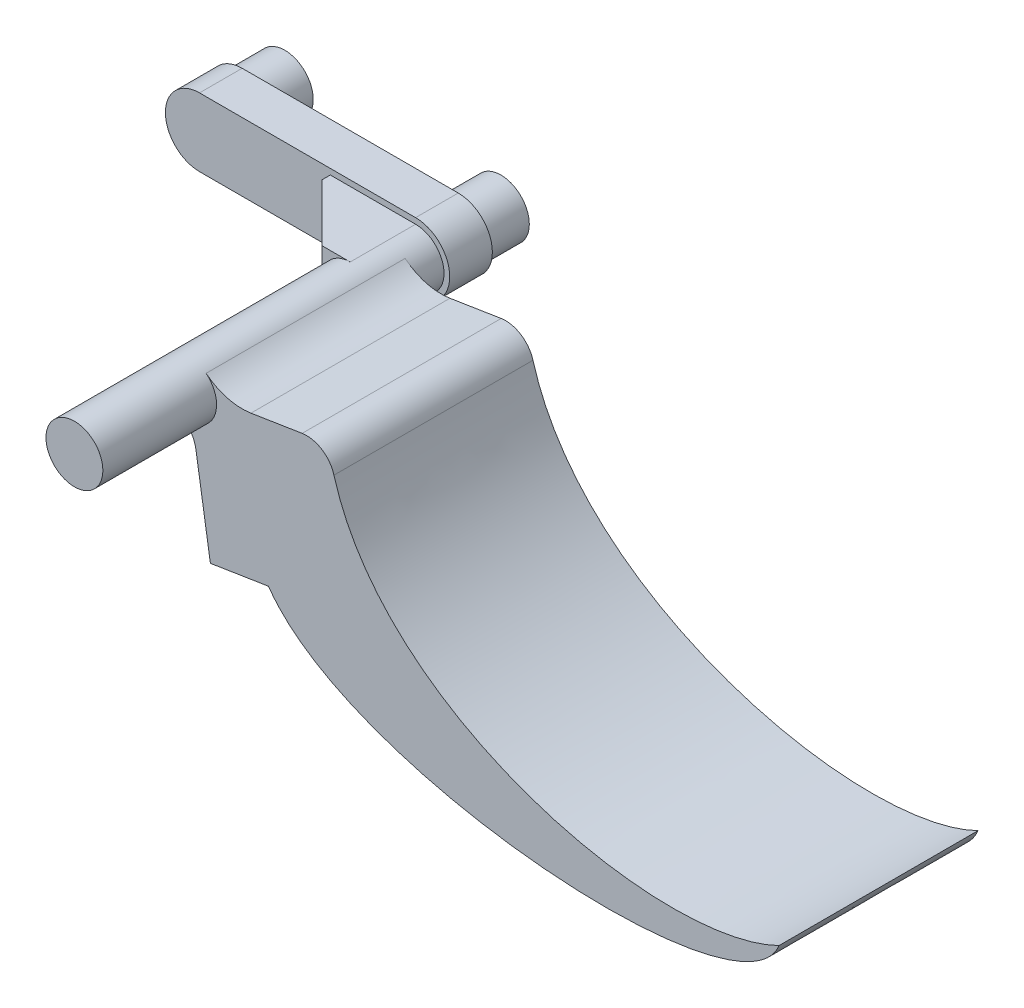
ISO-10303-21;
HEADER;
FILE_DESCRIPTION(('STEP AP214'),'2;1');
FILE_NAME('part.step','',(''),(''),'','','');
FILE_SCHEMA(('AUTOMOTIVE_DESIGN { 1 0 10303 214 1 1 1 1 }'));
ENDSEC;
DATA;
#1=APPLICATION_CONTEXT('core data for automotive mechanical design processes');
#2=APPLICATION_PROTOCOL_DEFINITION('international standard','automotive_design',2000,#1);
#3=PRODUCT_CONTEXT('',#1,'mechanical');
#4=PRODUCT('Part','Part','',(#3));
#5=PRODUCT_RELATED_PRODUCT_CATEGORY('part','',(#4));
#6=PRODUCT_DEFINITION_FORMATION('','',#4);
#7=PRODUCT_DEFINITION_CONTEXT('part definition',#1,'design');
#8=PRODUCT_DEFINITION('design','',#6,#7);
#9=PRODUCT_DEFINITION_SHAPE('','',#8);
#10=(LENGTH_UNIT() NAMED_UNIT(*) SI_UNIT(.MILLI.,.METRE.));
#11=(NAMED_UNIT(*) PLANE_ANGLE_UNIT() SI_UNIT($,.RADIAN.));
#12=(NAMED_UNIT(*) SI_UNIT($,.STERADIAN.) SOLID_ANGLE_UNIT());
#13=UNCERTAINTY_MEASURE_WITH_UNIT(LENGTH_MEASURE(1.E-05),#10,'distance_accuracy_value','');
#14=(GEOMETRIC_REPRESENTATION_CONTEXT(3) GLOBAL_UNCERTAINTY_ASSIGNED_CONTEXT((#13)) GLOBAL_UNIT_ASSIGNED_CONTEXT((#10,
#11,#12)) REPRESENTATION_CONTEXT('',''));
#15=CARTESIAN_POINT('',(0.,0.,0.));
#16=DIRECTION('',(0.,0.,1.));
#17=DIRECTION('',(1.,0.,0.));
#18=AXIS2_PLACEMENT_3D('',#15,#16,#17);
#19=CARTESIAN_POINT('',(0.,0.,5.3));
#20=DIRECTION('',(0.,0.,-1.));
#21=DIRECTION('',(-1.,0.,0.));
#22=AXIS2_PLACEMENT_3D('',#19,#20,#21);
#23=PLANE('',#22);
#24=DIRECTION('',(-1.,0.,0.));
#25=VECTOR('',#24,1.);
#26=CARTESIAN_POINT('',(0.,1.,5.3));
#27=LINE('',#26,#25);
#28=CARTESIAN_POINT('',(0.,1.,5.3));
#29=VERTEX_POINT('',#28);
#30=CARTESIAN_POINT('',(-1.00000000000001,1.,5.3));
#31=VERTEX_POINT('',#30);
#32=EDGE_CURVE('E315',#29,#31,#27,.T.);
#33=ORIENTED_EDGE('',*,*,#32,.T.);
#34=DIRECTION('',(0.,-1.,0.));
#35=VECTOR('',#34,1.);
#36=CARTESIAN_POINT('',(-1.00000000000001,0.,5.3));
#37=LINE('',#36,#35);
#38=CARTESIAN_POINT('',(-1.00000000000001,0.,5.3));
#39=VERTEX_POINT('',#38);
#40=EDGE_CURVE('E317',#31,#39,#37,.T.);
#41=ORIENTED_EDGE('',*,*,#40,.T.);
#42=CARTESIAN_POINT('',(0.,0.,5.3));
#43=DIRECTION('',(0.,0.,-1.));
#44=DIRECTION('',(-1.,0.,0.));
#45=AXIS2_PLACEMENT_3D('',#42,#43,#44);
#46=CIRCLE('',#45,1.);
#47=EDGE_CURVE('E319',#39,#29,#46,.T.);
#48=ORIENTED_EDGE('',*,*,#47,.T.);
#49=EDGE_LOOP('',(#33,#41,#48));
#50=FACE_BOUND('',#49,.T.);
#51=ADVANCED_FACE('F35',(#50),#23,.F.);
#52=CARTESIAN_POINT('',(0.,0.,15.));
#53=DIRECTION('',(0.,0.,-1.));
#54=DIRECTION('',(-1.,0.,0.));
#55=AXIS2_PLACEMENT_3D('',#52,#53,#54);
#56=CYLINDRICAL_SURFACE('',#55,1.);
#57=CARTESIAN_POINT('',(0.,0.,15.));
#58=DIRECTION('',(0.,0.,1.));
#59=DIRECTION('',(1.,0.,0.));
#60=AXIS2_PLACEMENT_3D('',#57,#58,#59);
#61=CIRCLE('',#60,1.);
#62=CARTESIAN_POINT('',(1.,0.,15.));
#63=VERTEX_POINT('',#62);
#64=EDGE_CURVE('E379',#63,#63,#61,.T.);
#65=ORIENTED_EDGE('',*,*,#64,.F.);
#66=EDGE_LOOP('',(#65));
#67=FACE_BOUND('',#66,.T.);
#68=DIRECTION('',(0.,0.,-1.));
#69=VECTOR('',#68,1.);
#70=CARTESIAN_POINT('',(0.631889780024741,0.775058259681351,15.));
#71=LINE('',#70,#69);
#72=CARTESIAN_POINT('',(0.631889780024741,0.775058259681351,11.));
#73=VERTEX_POINT('',#72);
#74=CARTESIAN_POINT('',(0.631889780024741,0.775058259681351,4.));
#75=VERTEX_POINT('',#74);
#76=EDGE_CURVE('E338',#73,#75,#71,.T.);
#77=ORIENTED_EDGE('',*,*,#76,.T.);
#78=CARTESIAN_POINT('',(0.,0.,4.));
#79=DIRECTION('',(0.,0.,-1.));
#80=DIRECTION('',(-1.,0.,0.));
#81=AXIS2_PLACEMENT_3D('',#78,#79,#80);
#82=CIRCLE('',#81,1.);
#83=CARTESIAN_POINT('',(0.,-1.,4.));
#84=VERTEX_POINT('',#83);
#85=EDGE_CURVE('E368',#75,#84,#82,.T.);
#86=ORIENTED_EDGE('',*,*,#85,.T.);
#87=DIRECTION('',(0.,0.,-1.));
#88=VECTOR('',#87,1.);
#89=CARTESIAN_POINT('',(0.,-1.,5.3));
#90=LINE('',#89,#88);
#91=CARTESIAN_POINT('',(0.,-1.,3.));
#92=VERTEX_POINT('',#91);
#93=EDGE_CURVE('E429',#84,#92,#90,.T.);
#94=ORIENTED_EDGE('',*,*,#93,.T.);
#95=CARTESIAN_POINT('',(0.,0.,3.));
#96=DIRECTION('',(0.,0.,-1.));
#97=DIRECTION('',(-1.,0.,0.));
#98=AXIS2_PLACEMENT_3D('',#95,#96,#97);
#99=CIRCLE('',#98,1.);
#100=CARTESIAN_POINT('',(0.,1.,3.));
#101=VERTEX_POINT('',#100);
#102=EDGE_CURVE('E376',#101,#92,#99,.T.);
#103=ORIENTED_EDGE('',*,*,#102,.F.);
#104=DIRECTION('',(0.,0.,-1.));
#105=VECTOR('',#104,1.);
#106=CARTESIAN_POINT('',(0.,1.,5.3));
#107=LINE('',#106,#105);
#108=EDGE_CURVE('E423',#29,#101,#107,.T.);
#109=ORIENTED_EDGE('',*,*,#108,.F.);
#110=ORIENTED_EDGE('',*,*,#47,.F.);
#111=CARTESIAN_POINT('',(-0.358367949545297,-0.933580426497203,5.3));
#112=VERTEX_POINT('',#111);
#113=EDGE_CURVE('E370',#112,#39,#46,.T.);
#114=ORIENTED_EDGE('',*,*,#113,.F.);
#115=DIRECTION('',(0.,0.,-1.));
#116=VECTOR('',#115,1.);
#117=CARTESIAN_POINT('',(-0.358367949545297,-0.933580426497203,15.));
#118=LINE('',#117,#116);
#119=CARTESIAN_POINT('',(-0.358367949545297,-0.933580426497203,11.));
#120=VERTEX_POINT('',#119);
#121=EDGE_CURVE('E347',#112,#120,#118,.F.);
#122=ORIENTED_EDGE('',*,*,#121,.T.);
#123=CARTESIAN_POINT('',(0.,0.,11.));
#124=DIRECTION('',(0.,0.,-1.));
#125=DIRECTION('',(-1.,0.,0.));
#126=AXIS2_PLACEMENT_3D('',#123,#124,#125);
#127=CIRCLE('',#126,1.);
#128=EDGE_CURVE('E366',#73,#120,#127,.T.);
#129=ORIENTED_EDGE('',*,*,#128,.F.);
#130=EDGE_LOOP('',(#77,#86,#94,#103,#109,#110,#114,#122,#129));
#131=FACE_BOUND('',#130,.T.);
#132=ADVANCED_FACE('F260',(#67,#131),#56,.T.);
#133=CARTESIAN_POINT('',(0.,0.00103630288871351,3.));
#134=DIRECTION('',(0.,0.,-1.));
#135=DIRECTION('',(-1.,0.,0.));
#136=AXIS2_PLACEMENT_3D('',#133,#134,#135);
#137=PLANE('',#136);
#138=CARTESIAN_POINT('',(0.,0.00103630288871351,3.));
#139=DIRECTION('',(0.,0.,-1.));
#140=DIRECTION('',(-1.,0.,0.));
#141=AXIS2_PLACEMENT_3D('',#138,#139,#140);
#142=CIRCLE('',#141,1.2);
#143=CARTESIAN_POINT('',(0.,1.20103630288871,3.));
#144=VERTEX_POINT('',#143);
#145=CARTESIAN_POINT('',(0.,-1.19896369711129,3.));
#146=VERTEX_POINT('',#145);
#147=EDGE_CURVE('E400',#144,#146,#142,.T.);
#148=ORIENTED_EDGE('',*,*,#147,.F.);
#149=DIRECTION('',(1.,0.,0.));
#150=VECTOR('',#149,1.);
#151=CARTESIAN_POINT('',(0.,1.20103630288871,3.));
#152=LINE('',#151,#150);
#153=CARTESIAN_POINT('',(-7.6,1.20103630288872,3.));
#154=VERTEX_POINT('',#153);
#155=EDGE_CURVE('E392',#154,#144,#152,.T.);
#156=ORIENTED_EDGE('',*,*,#155,.F.);
#157=CARTESIAN_POINT('',(-7.6,0.00103630288871459,3.));
#158=DIRECTION('',(0.,0.,-1.));
#159=DIRECTION('',(-1.,0.,0.));
#160=AXIS2_PLACEMENT_3D('',#157,#158,#159);
#161=CIRCLE('',#160,1.2);
#162=CARTESIAN_POINT('',(-7.6,-1.19896369711129,3.));
#163=VERTEX_POINT('',#162);
#164=EDGE_CURVE('E413',#163,#154,#161,.T.);
#165=ORIENTED_EDGE('',*,*,#164,.F.);
#166=DIRECTION('',(-1.,0.,0.));
#167=VECTOR('',#166,1.);
#168=CARTESIAN_POINT('',(0.,-1.19896369711129,3.));
#169=LINE('',#168,#167);
#170=EDGE_CURVE('E416',#146,#163,#169,.T.);
#171=ORIENTED_EDGE('',*,*,#170,.F.);
#172=EDGE_LOOP('',(#148,#156,#165,#171));
#173=FACE_BOUND('',#172,.T.);
#174=DIRECTION('',(-1.,0.,0.));
#175=VECTOR('',#174,1.);
#176=CARTESIAN_POINT('',(0.,1.,3.));
#177=LINE('',#176,#175);
#178=CARTESIAN_POINT('',(-3.,1.,3.));
#179=VERTEX_POINT('',#178);
#180=EDGE_CURVE('E436',#101,#179,#177,.T.);
#181=ORIENTED_EDGE('',*,*,#180,.F.);
#182=ORIENTED_EDGE('',*,*,#102,.T.);
#183=DIRECTION('',(1.,0.,0.));
#184=VECTOR('',#183,1.);
#185=CARTESIAN_POINT('',(0.,-1.,3.));
#186=LINE('',#185,#184);
#187=CARTESIAN_POINT('',(-3.,-1.,3.));
#188=VERTEX_POINT('',#187);
#189=EDGE_CURVE('E323',#188,#92,#186,.T.);
#190=ORIENTED_EDGE('',*,*,#189,.F.);
#191=DIRECTION('',(0.,-1.,0.));
#192=VECTOR('',#191,1.);
#193=CARTESIAN_POINT('',(-3.,1.,3.));
#194=LINE('',#193,#192);
#195=EDGE_CURVE('E433',#179,#188,#194,.T.);
#196=ORIENTED_EDGE('',*,*,#195,.F.);
#197=EDGE_LOOP('',(#181,#182,#190,#196));
#198=FACE_BOUND('',#197,.T.);
#199=ADVANCED_FACE('F256',(#173,#198),#137,.F.);
#200=CARTESIAN_POINT('',(0.,0.,15.));
#201=DIRECTION('',(0.,0.,1.));
#202=DIRECTION('',(1.,0.,0.));
#203=AXIS2_PLACEMENT_3D('',#200,#201,#202);
#204=PLANE('',#203);
#205=ORIENTED_EDGE('',*,*,#64,.T.);
#206=EDGE_LOOP('',(#205));
#207=FACE_BOUND('',#206,.T.);
#208=ADVANCED_FACE('F259',(#207),#204,.T.);
#209=CARTESIAN_POINT('',(0.,0.00103630288871351,3.));
#210=DIRECTION('',(0.,0.,-1.));
#211=DIRECTION('',(-1.,0.,0.));
#212=AXIS2_PLACEMENT_3D('',#209,#210,#211);
#213=CYLINDRICAL_SURFACE('',#212,1.2);
#214=CARTESIAN_POINT('',(0.,0.00103630288871351,1.5));
#215=DIRECTION('',(0.,0.,-1.));
#216=DIRECTION('',(-1.,0.,0.));
#217=AXIS2_PLACEMENT_3D('',#214,#215,#216);
#218=CIRCLE('',#217,1.2);
#219=CARTESIAN_POINT('',(0.,1.20103630288871,1.5));
#220=VERTEX_POINT('',#219);
#221=CARTESIAN_POINT('',(0.,-1.19896369711129,1.5));
#222=VERTEX_POINT('',#221);
#223=EDGE_CURVE('E407',#220,#222,#218,.T.);
#224=ORIENTED_EDGE('',*,*,#223,.F.);
#225=DIRECTION('',(0.,0.,-1.));
#226=VECTOR('',#225,1.);
#227=CARTESIAN_POINT('',(0.,1.20103630288871,3.));
#228=LINE('',#227,#226);
#229=EDGE_CURVE('E384',#144,#220,#228,.T.);
#230=ORIENTED_EDGE('',*,*,#229,.F.);
#231=ORIENTED_EDGE('',*,*,#147,.T.);
#232=DIRECTION('',(0.,0.,-1.));
#233=VECTOR('',#232,1.);
#234=CARTESIAN_POINT('',(0.,-1.19896369711129,3.));
#235=LINE('',#234,#233);
#236=EDGE_CURVE('E389',#146,#222,#235,.T.);
#237=ORIENTED_EDGE('',*,*,#236,.T.);
#238=EDGE_LOOP('',(#224,#230,#231,#237));
#239=FACE_BOUND('',#238,.T.);
#240=ADVANCED_FACE('F272',(#239),#213,.T.);
#241=CARTESIAN_POINT('',(0.,1.20103630288871,3.));
#242=DIRECTION('',(0.,1.,0.));
#243=DIRECTION('',(-1.,0.,0.));
#244=AXIS2_PLACEMENT_3D('',#241,#242,#243);
#245=PLANE('',#244);
#246=DIRECTION('',(1.,0.,0.));
#247=VECTOR('',#246,1.);
#248=CARTESIAN_POINT('',(0.,1.20103630288871,1.5));
#249=LINE('',#248,#247);
#250=CARTESIAN_POINT('',(-7.6,1.20103630288872,1.5));
#251=VERTEX_POINT('',#250);
#252=EDGE_CURVE('E397',#251,#220,#249,.T.);
#253=ORIENTED_EDGE('',*,*,#252,.F.);
#254=DIRECTION('',(0.,0.,-1.));
#255=VECTOR('',#254,1.);
#256=CARTESIAN_POINT('',(-7.6,1.20103630288872,3.));
#257=LINE('',#256,#255);
#258=EDGE_CURVE('E394',#154,#251,#257,.T.);
#259=ORIENTED_EDGE('',*,*,#258,.F.);
#260=ORIENTED_EDGE('',*,*,#155,.T.);
#261=ORIENTED_EDGE('',*,*,#229,.T.);
#262=EDGE_LOOP('',(#253,#259,#260,#261));
#263=FACE_BOUND('',#262,.T.);
#264=ADVANCED_FACE('F268',(#263),#245,.T.);
#265=CARTESIAN_POINT('',(-7.6,0.00103630288871459,3.));
#266=DIRECTION('',(0.,0.,-1.));
#267=DIRECTION('',(-1.,0.,0.));
#268=AXIS2_PLACEMENT_3D('',#265,#266,#267);
#269=CYLINDRICAL_SURFACE('',#268,1.2);
#270=CARTESIAN_POINT('',(-7.6,0.00103630288871459,1.5));
#271=DIRECTION('',(0.,0.,-1.));
#272=DIRECTION('',(-1.,0.,0.));
#273=AXIS2_PLACEMENT_3D('',#270,#271,#272);
#274=CIRCLE('',#273,1.2);
#275=CARTESIAN_POINT('',(-7.6,-1.19896369711129,1.5));
#276=VERTEX_POINT('',#275);
#277=EDGE_CURVE('E401',#276,#251,#274,.T.);
#278=ORIENTED_EDGE('',*,*,#277,.F.);
#279=DIRECTION('',(0.,0.,-1.));
#280=VECTOR('',#279,1.);
#281=CARTESIAN_POINT('',(-7.6,-1.19896369711129,3.));
#282=LINE('',#281,#280);
#283=EDGE_CURVE('E391',#163,#276,#282,.T.);
#284=ORIENTED_EDGE('',*,*,#283,.F.);
#285=ORIENTED_EDGE('',*,*,#164,.T.);
#286=ORIENTED_EDGE('',*,*,#258,.T.);
#287=EDGE_LOOP('',(#278,#284,#285,#286));
#288=FACE_BOUND('',#287,.T.);
#289=ADVANCED_FACE('F271',(#288),#269,.T.);
#290=CARTESIAN_POINT('',(0.,-1.19896369711129,3.));
#291=DIRECTION('',(0.,-1.,0.));
#292=DIRECTION('',(0.,0.,-1.));
#293=AXIS2_PLACEMENT_3D('',#290,#291,#292);
#294=PLANE('',#293);
#295=DIRECTION('',(-1.,0.,0.));
#296=VECTOR('',#295,1.);
#297=CARTESIAN_POINT('',(0.,-1.19896369711129,1.5));
#298=LINE('',#297,#296);
#299=EDGE_CURVE('E404',#222,#276,#298,.T.);
#300=ORIENTED_EDGE('',*,*,#299,.F.);
#301=ORIENTED_EDGE('',*,*,#236,.F.);
#302=ORIENTED_EDGE('',*,*,#170,.T.);
#303=ORIENTED_EDGE('',*,*,#283,.T.);
#304=EDGE_LOOP('',(#300,#301,#302,#303));
#305=FACE_BOUND('',#304,.T.);
#306=ADVANCED_FACE('F266',(#305),#294,.T.);
#307=CARTESIAN_POINT('',(0.,0.00103630288871351,1.5));
#308=DIRECTION('',(0.,0.,-1.));
#309=DIRECTION('',(-1.,0.,0.));
#310=AXIS2_PLACEMENT_3D('',#307,#308,#309);
#311=PLANE('',#310);
#312=CARTESIAN_POINT('',(-7.6,0.00103630288871459,1.5));
#313=DIRECTION('',(0.,0.,-1.));
#314=DIRECTION('',(-1.,0.,0.));
#315=AXIS2_PLACEMENT_3D('',#312,#313,#314);
#316=CIRCLE('',#315,0.999999999999999);
#317=CARTESIAN_POINT('',(-8.6,0.00103630288871459,1.5));
#318=VERTEX_POINT('',#317);
#319=EDGE_CURVE('E373',#318,#318,#316,.T.);
#320=ORIENTED_EDGE('',*,*,#319,.F.);
#321=EDGE_LOOP('',(#320));
#322=FACE_BOUND('',#321,.T.);
#323=CARTESIAN_POINT('',(0.,0.,1.5));
#324=DIRECTION('',(0.,0.,-1.));
#325=DIRECTION('',(-1.,0.,0.));
#326=AXIS2_PLACEMENT_3D('',#323,#324,#325);
#327=CIRCLE('',#326,1.);
#328=CARTESIAN_POINT('',(-1.,0.,1.5));
#329=VERTEX_POINT('',#328);
#330=EDGE_CURVE('E380',#329,#329,#327,.T.);
#331=ORIENTED_EDGE('',*,*,#330,.F.);
#332=EDGE_LOOP('',(#331));
#333=FACE_BOUND('',#332,.T.);
#334=ORIENTED_EDGE('',*,*,#223,.T.);
#335=ORIENTED_EDGE('',*,*,#299,.T.);
#336=ORIENTED_EDGE('',*,*,#277,.T.);
#337=ORIENTED_EDGE('',*,*,#252,.T.);
#338=EDGE_LOOP('',(#334,#335,#336,#337));
#339=FACE_BOUND('',#338,.T.);
#340=ADVANCED_FACE('F262',(#322,#333,#339),#311,.T.);
#341=CARTESIAN_POINT('',(0.,0.,0.));
#342=DIRECTION('',(0.,0.,1.));
#343=DIRECTION('',(1.,0.,0.));
#344=AXIS2_PLACEMENT_3D('',#341,#342,#343);
#345=PLANE('',#344);
#346=CARTESIAN_POINT('',(0.,0.,0.));
#347=DIRECTION('',(0.,0.,1.));
#348=DIRECTION('',(1.,0.,0.));
#349=AXIS2_PLACEMENT_3D('',#346,#347,#348);
#350=CIRCLE('',#349,1.);
#351=CARTESIAN_POINT('',(1.,0.,0.));
#352=VERTEX_POINT('',#351);
#353=EDGE_CURVE('E383',#352,#352,#350,.T.);
#354=ORIENTED_EDGE('',*,*,#353,.F.);
#355=EDGE_LOOP('',(#354));
#356=FACE_BOUND('',#355,.T.);
#357=ADVANCED_FACE('F265',(#356),#345,.F.);
#358=ORIENTED_EDGE('',*,*,#330,.T.);
#359=EDGE_LOOP('',(#358));
#360=FACE_BOUND('',#359,.T.);
#361=ORIENTED_EDGE('',*,*,#353,.T.);
#362=EDGE_LOOP('',(#361));
#363=FACE_BOUND('',#362,.T.);
#364=ADVANCED_FACE('F254',(#360,#363),#56,.T.);
#365=CARTESIAN_POINT('',(-7.6,0.00103630288871459,0.));
#366=DIRECTION('',(0.,0.,1.));
#367=DIRECTION('',(1.,0.,0.));
#368=AXIS2_PLACEMENT_3D('',#365,#366,#367);
#369=CYLINDRICAL_SURFACE('',#368,0.999999999999999);
#370=ORIENTED_EDGE('',*,*,#319,.T.);
#371=EDGE_LOOP('',(#370));
#372=FACE_BOUND('',#371,.T.);
#373=CARTESIAN_POINT('',(-7.6,0.00103630288871459,0.));
#374=DIRECTION('',(0.,0.,1.));
#375=DIRECTION('',(1.,0.,0.));
#376=AXIS2_PLACEMENT_3D('',#373,#374,#375);
#377=CIRCLE('',#376,0.999999999999999);
#378=CARTESIAN_POINT('',(-6.6,0.00103630288871459,0.));
#379=VERTEX_POINT('',#378);
#380=EDGE_CURVE('E410',#379,#379,#377,.T.);
#381=ORIENTED_EDGE('',*,*,#380,.T.);
#382=EDGE_LOOP('',(#381));
#383=FACE_BOUND('',#382,.T.);
#384=ADVANCED_FACE('F250',(#372,#383),#369,.T.);
#385=CARTESIAN_POINT('',(-7.6,0.00103630288871459,0.));
#386=DIRECTION('',(0.,0.,1.));
#387=DIRECTION('',(1.,0.,0.));
#388=AXIS2_PLACEMENT_3D('',#385,#386,#387);
#389=PLANE('',#388);
#390=ORIENTED_EDGE('',*,*,#380,.F.);
#391=EDGE_LOOP('',(#390));
#392=FACE_BOUND('',#391,.T.);
#393=ADVANCED_FACE('F246',(#392),#389,.F.);
#394=CARTESIAN_POINT('',(0.,1.,5.3));
#395=DIRECTION('',(0.,-1.,0.));
#396=DIRECTION('',(1.,0.,0.));
#397=AXIS2_PLACEMENT_3D('',#394,#395,#396);
#398=PLANE('',#397);
#399=DIRECTION('',(0.,0.,-1.));
#400=VECTOR('',#399,1.);
#401=CARTESIAN_POINT('',(-3.,1.,5.3));
#402=LINE('',#401,#400);
#403=CARTESIAN_POINT('',(-3.,1.,3.3));
#404=VERTEX_POINT('',#403);
#405=EDGE_CURVE('E425',#404,#179,#402,.T.);
#406=ORIENTED_EDGE('',*,*,#405,.F.);
#407=DIRECTION('',(-0.707106781186546,0.,-0.707106781186549));
#408=VECTOR('',#407,1.);
#409=CARTESIAN_POINT('',(-1.00000000000001,1.,5.3));
#410=LINE('',#409,#408);
#411=EDGE_CURVE('E11',#404,#31,#410,.F.);
#412=ORIENTED_EDGE('',*,*,#411,.T.);
#413=ORIENTED_EDGE('',*,*,#32,.F.);
#414=ORIENTED_EDGE('',*,*,#108,.T.);
#415=ORIENTED_EDGE('',*,*,#180,.T.);
#416=EDGE_LOOP('',(#406,#412,#413,#414,#415));
#417=FACE_BOUND('',#416,.T.);
#418=ADVANCED_FACE('F243',(#417),#398,.F.);
#419=CARTESIAN_POINT('',(-3.,1.,5.3));
#420=DIRECTION('',(1.,0.,0.));
#421=DIRECTION('',(0.,0.,-1.));
#422=AXIS2_PLACEMENT_3D('',#419,#420,#421);
#423=PLANE('',#422);
#424=DIRECTION('',(0.,0.,-1.));
#425=VECTOR('',#424,1.);
#426=CARTESIAN_POINT('',(-3.,-1.,5.3));
#427=LINE('',#426,#425);
#428=CARTESIAN_POINT('',(-3.,-1.,3.3));
#429=VERTEX_POINT('',#428);
#430=EDGE_CURVE('E427',#429,#188,#427,.T.);
#431=ORIENTED_EDGE('',*,*,#430,.F.);
#432=DIRECTION('',(0.,1.,0.));
#433=VECTOR('',#432,1.);
#434=CARTESIAN_POINT('',(-3.,1.,3.3));
#435=LINE('',#434,#433);
#436=EDGE_CURVE('E44',#429,#404,#435,.T.);
#437=ORIENTED_EDGE('',*,*,#436,.T.);
#438=ORIENTED_EDGE('',*,*,#405,.T.);
#439=ORIENTED_EDGE('',*,*,#195,.T.);
#440=EDGE_LOOP('',(#431,#437,#438,#439));
#441=FACE_BOUND('',#440,.T.);
#442=ADVANCED_FACE('F240',(#441),#423,.F.);
#443=CARTESIAN_POINT('',(0.,-1.,5.3));
#444=DIRECTION('',(0.,1.,0.));
#445=DIRECTION('',(0.,0.,1.));
#446=AXIS2_PLACEMENT_3D('',#443,#444,#445);
#447=PLANE('',#446);
#448=DIRECTION('',(1.,0.,0.));
#449=VECTOR('',#448,1.);
#450=CARTESIAN_POINT('',(0.,-1.,5.3));
#451=LINE('',#450,#449);
#452=CARTESIAN_POINT('',(-1.00000000000001,-1.,5.3));
#453=VERTEX_POINT('',#452);
#454=CARTESIAN_POINT('',(-0.218707732182321,-1.,5.3));
#455=VERTEX_POINT('',#454);
#456=EDGE_CURVE('E322',#453,#455,#451,.T.);
#457=ORIENTED_EDGE('',*,*,#456,.F.);
#458=DIRECTION('',(0.707106781186546,0.,0.707106781186549));
#459=VECTOR('',#458,1.);
#460=CARTESIAN_POINT('',(-1.00000000000001,-1.,5.3));
#461=LINE('',#460,#459);
#462=EDGE_CURVE('E58',#453,#429,#461,.F.);
#463=ORIENTED_EDGE('',*,*,#462,.T.);
#464=ORIENTED_EDGE('',*,*,#430,.T.);
#465=ORIENTED_EDGE('',*,*,#189,.T.);
#466=ORIENTED_EDGE('',*,*,#93,.F.);
#467=DIRECTION('',(-1.,0.,0.));
#468=VECTOR('',#467,1.);
#469=CARTESIAN_POINT('',(0.,-1.,4.));
#470=LINE('',#469,#468);
#471=CARTESIAN_POINT('',(-0.218707732182321,-1.,4.));
#472=VERTEX_POINT('',#471);
#473=EDGE_CURVE('E355',#84,#472,#470,.T.);
#474=ORIENTED_EDGE('',*,*,#473,.T.);
#475=DIRECTION('',(0.,0.,-1.));
#476=VECTOR('',#475,1.);
#477=CARTESIAN_POINT('',(-0.218707732182321,-1.,15.));
#478=LINE('',#477,#476);
#479=EDGE_CURVE('E352',#472,#455,#478,.F.);
#480=ORIENTED_EDGE('',*,*,#479,.T.);
#481=EDGE_LOOP('',(#457,#463,#464,#465,#466,#474,#480));
#482=FACE_BOUND('',#481,.T.);
#483=ADVANCED_FACE('F236',(#482),#447,.F.);
#484=ORIENTED_EDGE('',*,*,#113,.T.);
#485=DIRECTION('',(0.,-1.,0.));
#486=VECTOR('',#485,1.);
#487=CARTESIAN_POINT('',(-1.00000000000001,0.,5.3));
#488=LINE('',#487,#486);
#489=EDGE_CURVE('E326',#39,#453,#488,.T.);
#490=ORIENTED_EDGE('',*,*,#489,.T.);
#491=ORIENTED_EDGE('',*,*,#456,.T.);
#492=CARTESIAN_POINT('',(-0.716735899090594,-1.86716085299441,5.3));
#493=DIRECTION('',(0.,0.,-1.));
#494=DIRECTION('',(-1.,0.,0.));
#495=AXIS2_PLACEMENT_3D('',#492,#493,#494);
#496=CIRCLE('',#495,1.);
#497=EDGE_CURVE('E350',#455,#112,#496,.F.);
#498=ORIENTED_EDGE('',*,*,#497,.T.);
#499=EDGE_LOOP('',(#484,#490,#491,#498));
#500=FACE_BOUND('',#499,.T.);
#501=ADVANCED_FACE('F232',(#500),#23,.F.);
#502=CARTESIAN_POINT('',(0.,0.,11.));
#503=DIRECTION('',(-0.156434465040235,0.987688340595137,0.));
#504=DIRECTION('',(-0.987688340595137,-0.156434465040235,0.));
#505=AXIS2_PLACEMENT_3D('',#502,#503,#504);
#506=PLANE('',#505);
#507=DIRECTION('',(0.987688340595137,0.156434465040234,0.));
#508=VECTOR('',#507,1.);
#509=CARTESIAN_POINT('',(0.,0.,4.));
#510=LINE('',#509,#508);
#511=CARTESIAN_POINT('',(2.20853827015469,0.349798097853779,4.));
#512=VERTEX_POINT('',#511);
#513=CARTESIAN_POINT('',(4.00977644076124,0.635086197396496,4.));
#514=VERTEX_POINT('',#513);
#515=EDGE_CURVE('E450',#512,#514,#510,.T.);
#516=ORIENTED_EDGE('',*,*,#515,.F.);
#517=DIRECTION('',(0.,0.,-1.));
#518=VECTOR('',#517,1.);
#519=CARTESIAN_POINT('',(2.20853827015469,0.349798097853779,11.));
#520=LINE('',#519,#518);
#521=CARTESIAN_POINT('',(2.20853827015469,0.349798097853779,11.));
#522=VERTEX_POINT('',#521);
#523=EDGE_CURVE('E336',#512,#522,#520,.F.);
#524=ORIENTED_EDGE('',*,*,#523,.T.);
#525=DIRECTION('',(0.987688340595137,0.156434465040234,0.));
#526=VECTOR('',#525,1.);
#527=CARTESIAN_POINT('',(0.,0.,11.));
#528=LINE('',#527,#526);
#529=CARTESIAN_POINT('',(4.00977644076124,0.635086197396496,11.));
#530=VERTEX_POINT('',#529);
#531=EDGE_CURVE('E447',#522,#530,#528,.T.);
#532=ORIENTED_EDGE('',*,*,#531,.T.);
#533=DIRECTION('',(0.,0.,-1.));
#534=VECTOR('',#533,1.);
#535=CARTESIAN_POINT('',(4.00977644076124,0.635086197396496,11.));
#536=LINE('',#535,#534);
#537=EDGE_CURVE('E363',#530,#514,#536,.T.);
#538=ORIENTED_EDGE('',*,*,#537,.T.);
#539=EDGE_LOOP('',(#516,#524,#532,#538));
#540=FACE_BOUND('',#539,.T.);
#541=ADVANCED_FACE('F225',(#540),#506,.T.);
#542=CARTESIAN_POINT('',(0.,0.,11.));
#543=DIRECTION('',(-0.987688340595137,-0.156434465040235,0.));
#544=DIRECTION('',(0.156434465040235,-0.987688340595137,0.));
#545=AXIS2_PLACEMENT_3D('',#542,#543,#544);
#546=PLANE('',#545);
#547=DIRECTION('',(-0.156434465040234,0.987688340595137,0.));
#548=VECTOR('',#547,1.);
#549=CARTESIAN_POINT('',(0.,0.,11.));
#550=LINE('',#549,#548);
#551=CARTESIAN_POINT('',(0.782172325201172,-4.93844170297569,11.));
#552=VERTEX_POINT('',#551);
#553=CARTESIAN_POINT('',(0.270952441504543,-1.71072638795417,11.));
#554=VERTEX_POINT('',#553);
#555=EDGE_CURVE('E443',#552,#554,#550,.T.);
#556=ORIENTED_EDGE('',*,*,#555,.T.);
#557=DIRECTION('',(0.,0.,-1.));
#558=VECTOR('',#557,1.);
#559=CARTESIAN_POINT('',(0.270952441504543,-1.71072638795417,11.));
#560=LINE('',#559,#558);
#561=CARTESIAN_POINT('',(0.270952441504543,-1.71072638795417,4.));
#562=VERTEX_POINT('',#561);
#563=EDGE_CURVE('E345',#554,#562,#560,.T.);
#564=ORIENTED_EDGE('',*,*,#563,.T.);
#565=DIRECTION('',(-0.156434465040234,0.987688340595137,0.));
#566=VECTOR('',#565,1.);
#567=CARTESIAN_POINT('',(0.,0.,4.));
#568=LINE('',#567,#566);
#569=CARTESIAN_POINT('',(0.782172325201172,-4.93844170297569,4.));
#570=VERTEX_POINT('',#569);
#571=EDGE_CURVE('E444',#570,#562,#568,.T.);
#572=ORIENTED_EDGE('',*,*,#571,.F.);
#573=DIRECTION('',(0.,0.,-1.));
#574=VECTOR('',#573,1.);
#575=CARTESIAN_POINT('',(0.782172325201172,-4.93844170297569,11.));
#576=LINE('',#575,#574);
#577=EDGE_CURVE('E439',#552,#570,#576,.T.);
#578=ORIENTED_EDGE('',*,*,#577,.F.);
#579=EDGE_LOOP('',(#556,#564,#572,#578));
#580=FACE_BOUND('',#579,.T.);
#581=ADVANCED_FACE('F222',(#580),#546,.T.);
#582=CARTESIAN_POINT('',(0.782172325201172,-4.93844170297569,11.));
#583=DIRECTION('',(0.156434465040234,-0.987688340595137,0.));
#584=DIRECTION('',(0.987688340595137,0.156434465040234,0.));
#585=AXIS2_PLACEMENT_3D('',#582,#583,#584);
#586=PLANE('',#585);
#587=DIRECTION('',(0.,0.,-1.));
#588=VECTOR('',#587,1.);
#589=CARTESIAN_POINT('',(2.82663059289347,-4.61463132448036,11.));
#590=LINE('',#589,#588);
#591=CARTESIAN_POINT('',(2.82663059289347,-4.61463132448036,11.));
#592=VERTEX_POINT('',#591);
#593=CARTESIAN_POINT('',(2.82663059289347,-4.61463132448036,4.));
#594=VERTEX_POINT('',#593);
#595=EDGE_CURVE('E188',#592,#594,#590,.T.);
#596=ORIENTED_EDGE('',*,*,#595,.F.);
#597=DIRECTION('',(-0.987688340595137,-0.156434465040234,0.));
#598=VECTOR('',#597,1.);
#599=CARTESIAN_POINT('',(0.782172325201172,-4.93844170297569,11.));
#600=LINE('',#599,#598);
#601=EDGE_CURVE('E193',#592,#552,#600,.T.);
#602=ORIENTED_EDGE('',*,*,#601,.T.);
#603=ORIENTED_EDGE('',*,*,#577,.T.);
#604=DIRECTION('',(-0.987688340595137,-0.156434465040234,0.));
#605=VECTOR('',#604,1.);
#606=CARTESIAN_POINT('',(0.782172325201172,-4.93844170297569,4.));
#607=LINE('',#606,#605);
#608=EDGE_CURVE('E448',#594,#570,#607,.T.);
#609=ORIENTED_EDGE('',*,*,#608,.F.);
#610=EDGE_LOOP('',(#596,#602,#603,#609));
#611=FACE_BOUND('',#610,.T.);
#612=ADVANCED_FACE('F218',(#611),#586,.T.);
#613=CARTESIAN_POINT('',(0.,0.,11.));
#614=DIRECTION('',(0.,0.,-1.));
#615=DIRECTION('',(-1.,0.,0.));
#616=AXIS2_PLACEMENT_3D('',#613,#614,#615);
#617=PLANE('',#616);
#618=CARTESIAN_POINT('',(4.93844170297569,0.782172325201172,11.));
#619=CARTESIAN_POINT('',(6.03592471295213,-6.14706269136757,11.));
#620=CARTESIAN_POINT('',(16.4473078553857,-8.70788039402081,11.));
#621=CARTESIAN_POINT('',(20.7821723252012,-6.58248103840503,11.));
#622=B_SPLINE_CURVE_WITH_KNOTS('',3,(#618,#619,#620,#621),.UNSPECIFIED.,.F.,.F.,(4,4),(0.,1.),.UNSPECIFIED.);
#623=CARTESIAN_POINT('',(5.12813910541519,-0.0792998585614298,11.));
#624=VERTEX_POINT('',#623);
#625=CARTESIAN_POINT('',(20.7821723252012,-6.58248103840503,11.));
#626=VERTEX_POINT('',#625);
#627=EDGE_CURVE('E169',#624,#626,#622,.T.);
#628=ORIENTED_EDGE('',*,*,#627,.F.);
#629=CARTESIAN_POINT('',(4.16621090580148,-0.352602143198641,11.));
#630=DIRECTION('',(0.,0.,-1.));
#631=DIRECTION('',(-1.,0.,0.));
#632=AXIS2_PLACEMENT_3D('',#629,#630,#631);
#633=CIRCLE('',#632,1.);
#634=EDGE_CURVE('E358',#624,#530,#633,.F.);
#635=ORIENTED_EDGE('',*,*,#634,.T.);
#636=ORIENTED_EDGE('',*,*,#531,.F.);
#637=CARTESIAN_POINT('',(1.89566934007422,2.32517477904405,11.));
#638=DIRECTION('',(0.,0.,-1.));
#639=DIRECTION('',(-1.,0.,0.));
#640=AXIS2_PLACEMENT_3D('',#637,#638,#639);
#641=CIRCLE('',#640,2.);
#642=EDGE_CURVE('E329',#522,#73,#641,.T.);
#643=ORIENTED_EDGE('',*,*,#642,.T.);
#644=ORIENTED_EDGE('',*,*,#128,.T.);
#645=CARTESIAN_POINT('',(-0.716735899090594,-1.86716085299441,11.));
#646=DIRECTION('',(0.,0.,-1.));
#647=DIRECTION('',(-1.,0.,0.));
#648=AXIS2_PLACEMENT_3D('',#645,#646,#647);
#649=CIRCLE('',#648,1.);
#650=EDGE_CURVE('E343',#120,#554,#649,.T.);
#651=ORIENTED_EDGE('',*,*,#650,.T.);
#652=ORIENTED_EDGE('',*,*,#555,.F.);
#653=ORIENTED_EDGE('',*,*,#601,.F.);
#654=CARTESIAN_POINT('',(20.7821723252012,-6.58248103840503,11.));
#655=CARTESIAN_POINT('',(19.5025859515414,-9.76132866167443,11.));
#656=CARTESIAN_POINT('',(5.67735167401639,-8.78742509281271,11.));
#657=CARTESIAN_POINT('',(2.82663059289346,-4.61463132448035,11.));
#658=B_SPLINE_CURVE_WITH_KNOTS('',3,(#654,#655,#656,#657),.UNSPECIFIED.,.F.,.F.,(4,4),(0.,1.),.UNSPECIFIED.);
#659=EDGE_CURVE('E181',#626,#592,#658,.T.);
#660=ORIENTED_EDGE('',*,*,#659,.F.);
#661=EDGE_LOOP('',(#628,#635,#636,#643,#644,#651,#652,#653,#660));
#662=FACE_BOUND('',#661,.T.);
#663=ADVANCED_FACE('F191',(#662),#617,.F.);
#664=CARTESIAN_POINT('',(0.,0.,4.));
#665=DIRECTION('',(0.,0.,-1.));
#666=DIRECTION('',(-1.,0.,0.));
#667=AXIS2_PLACEMENT_3D('',#664,#665,#666);
#668=PLANE('',#667);
#669=ORIENTED_EDGE('',*,*,#85,.F.);
#670=CARTESIAN_POINT('',(1.89566934007422,2.32517477904405,4.));
#671=DIRECTION('',(0.,0.,-1.));
#672=DIRECTION('',(-1.,0.,0.));
#673=AXIS2_PLACEMENT_3D('',#670,#671,#672);
#674=CIRCLE('',#673,2.);
#675=EDGE_CURVE('E334',#75,#512,#674,.F.);
#676=ORIENTED_EDGE('',*,*,#675,.T.);
#677=ORIENTED_EDGE('',*,*,#515,.T.);
#678=CARTESIAN_POINT('',(4.16621090580148,-0.352602143198641,4.));
#679=DIRECTION('',(0.,0.,-1.));
#680=DIRECTION('',(-1.,0.,0.));
#681=AXIS2_PLACEMENT_3D('',#678,#679,#680);
#682=CIRCLE('',#681,1.);
#683=CARTESIAN_POINT('',(5.12813910541519,-0.0792998585614298,4.));
#684=VERTEX_POINT('',#683);
#685=EDGE_CURVE('E361',#514,#684,#682,.T.);
#686=ORIENTED_EDGE('',*,*,#685,.T.);
#687=CARTESIAN_POINT('',(4.93844170297569,0.782172325201172,4.));
#688=CARTESIAN_POINT('',(6.03592471295213,-6.14706269136757,4.));
#689=CARTESIAN_POINT('',(16.4473078553857,-8.70788039402081,4.));
#690=CARTESIAN_POINT('',(20.7821723252012,-6.58248103840503,4.));
#691=B_SPLINE_CURVE_WITH_KNOTS('',3,(#687,#688,#689,#690),.UNSPECIFIED.,.F.,.F.,(4,4),(0.,1.),.UNSPECIFIED.);
#692=CARTESIAN_POINT('',(20.7821723252012,-6.58248103840503,4.));
#693=VERTEX_POINT('',#692);
#694=EDGE_CURVE('E202',#684,#693,#691,.T.);
#695=ORIENTED_EDGE('',*,*,#694,.T.);
#696=CARTESIAN_POINT('',(20.7821723252012,-6.58248103840503,4.));
#697=CARTESIAN_POINT('',(19.5025859515414,-9.76132866167443,4.));
#698=CARTESIAN_POINT('',(5.67735167401639,-8.78742509281271,4.));
#699=CARTESIAN_POINT('',(2.82663059289346,-4.61463132448035,4.));
#700=B_SPLINE_CURVE_WITH_KNOTS('',3,(#696,#697,#698,#699),.UNSPECIFIED.,.F.,.F.,(4,4),(0.,1.),.UNSPECIFIED.);
#701=EDGE_CURVE('E182',#693,#594,#700,.T.);
#702=ORIENTED_EDGE('',*,*,#701,.T.);
#703=ORIENTED_EDGE('',*,*,#608,.T.);
#704=ORIENTED_EDGE('',*,*,#571,.T.);
#705=CARTESIAN_POINT('',(-0.716735899090594,-1.86716085299441,4.));
#706=DIRECTION('',(0.,0.,-1.));
#707=DIRECTION('',(-1.,0.,0.));
#708=AXIS2_PLACEMENT_3D('',#705,#706,#707);
#709=CIRCLE('',#708,1.);
#710=EDGE_CURVE('E341',#562,#472,#709,.F.);
#711=ORIENTED_EDGE('',*,*,#710,.T.);
#712=ORIENTED_EDGE('',*,*,#473,.F.);
#713=EDGE_LOOP('',(#669,#676,#677,#686,#695,#702,#703,#704,#711,#712));
#714=FACE_BOUND('',#713,.T.);
#715=ADVANCED_FACE('F215',(#714),#668,.T.);
#716=DIRECTION('',(0.,0.,-1.));
#717=VECTOR('',#716,1.);
#718=SURFACE_OF_LINEAR_EXTRUSION('',#622,#717);
#719=ORIENTED_EDGE('',*,*,#694,.F.);
#720=DIRECTION('',(0.,0.,-1.));
#721=VECTOR('',#720,1.);
#722=CARTESIAN_POINT('',(5.12813910541519,-0.0792998585614301,4.));
#723=LINE('',#722,#721);
#724=EDGE_CURVE('E176',#684,#624,#723,.F.);
#725=ORIENTED_EDGE('',*,*,#724,.T.);
#726=ORIENTED_EDGE('',*,*,#627,.T.);
#727=DIRECTION('',(0.,0.,-1.));
#728=VECTOR('',#727,1.);
#729=CARTESIAN_POINT('',(20.7821723252012,-6.58248103840503,11.));
#730=LINE('',#729,#728);
#731=EDGE_CURVE('E173',#626,#693,#730,.T.);
#732=ORIENTED_EDGE('',*,*,#731,.T.);
#733=EDGE_LOOP('',(#719,#725,#726,#732));
#734=FACE_BOUND('',#733,.T.);
#735=ADVANCED_FACE('F172',(#734),#718,.T.);
#736=DIRECTION('',(0.,0.,-1.));
#737=VECTOR('',#736,1.);
#738=SURFACE_OF_LINEAR_EXTRUSION('',#658,#737);
#739=ORIENTED_EDGE('',*,*,#701,.F.);
#740=ORIENTED_EDGE('',*,*,#731,.F.);
#741=ORIENTED_EDGE('',*,*,#659,.T.);
#742=ORIENTED_EDGE('',*,*,#595,.T.);
#743=EDGE_LOOP('',(#739,#740,#741,#742));
#744=FACE_BOUND('',#743,.T.);
#745=ADVANCED_FACE('F185',(#744),#738,.T.);
#746=CARTESIAN_POINT('',(4.16621090580148,-0.352602143198641,7.5));
#747=DIRECTION('',(0.,0.,-1.));
#748=DIRECTION('',(-1.,0.,0.));
#749=AXIS2_PLACEMENT_3D('',#746,#747,#748);
#750=CYLINDRICAL_SURFACE('',#749,1.);
#751=ORIENTED_EDGE('',*,*,#634,.F.);
#752=ORIENTED_EDGE('',*,*,#724,.F.);
#753=ORIENTED_EDGE('',*,*,#685,.F.);
#754=ORIENTED_EDGE('',*,*,#537,.F.);
#755=EDGE_LOOP('',(#751,#752,#753,#754));
#756=FACE_BOUND('',#755,.T.);
#757=ADVANCED_FACE('F212',(#756),#750,.T.);
#758=CARTESIAN_POINT('',(-0.716735899090594,-1.86716085299441,15.));
#759=DIRECTION('',(0.,0.,-1.));
#760=DIRECTION('',(-1.,0.,0.));
#761=AXIS2_PLACEMENT_3D('',#758,#759,#760);
#762=CYLINDRICAL_SURFACE('',#761,1.);
#763=ORIENTED_EDGE('',*,*,#710,.F.);
#764=ORIENTED_EDGE('',*,*,#563,.F.);
#765=ORIENTED_EDGE('',*,*,#650,.F.);
#766=ORIENTED_EDGE('',*,*,#121,.F.);
#767=ORIENTED_EDGE('',*,*,#497,.F.);
#768=ORIENTED_EDGE('',*,*,#479,.F.);
#769=EDGE_LOOP('',(#763,#764,#765,#766,#767,#768));
#770=FACE_BOUND('',#769,.T.);
#771=ADVANCED_FACE('F294',(#770),#762,.F.);
#772=CARTESIAN_POINT('',(1.89566934007422,2.32517477904405,15.));
#773=DIRECTION('',(0.,0.,-1.));
#774=DIRECTION('',(-1.,0.,0.));
#775=AXIS2_PLACEMENT_3D('',#772,#773,#774);
#776=CYLINDRICAL_SURFACE('',#775,2.);
#777=ORIENTED_EDGE('',*,*,#642,.F.);
#778=ORIENTED_EDGE('',*,*,#523,.F.);
#779=ORIENTED_EDGE('',*,*,#675,.F.);
#780=ORIENTED_EDGE('',*,*,#76,.F.);
#781=EDGE_LOOP('',(#777,#778,#779,#780));
#782=FACE_BOUND('',#781,.T.);
#783=ADVANCED_FACE('F297',(#782),#776,.F.);
#784=CARTESIAN_POINT('',(-1.00000000000001,0.,5.3));
#785=DIRECTION('',(0.707106781186549,0.,-0.707106781186546));
#786=DIRECTION('',(0.,-1.,0.));
#787=AXIS2_PLACEMENT_3D('',#784,#785,#786);
#788=PLANE('',#787);
#789=ORIENTED_EDGE('',*,*,#411,.F.);
#790=ORIENTED_EDGE('',*,*,#436,.F.);
#791=ORIENTED_EDGE('',*,*,#462,.F.);
#792=ORIENTED_EDGE('',*,*,#489,.F.);
#793=ORIENTED_EDGE('',*,*,#40,.F.);
#794=EDGE_LOOP('',(#789,#790,#791,#792,#793));
#795=FACE_BOUND('',#794,.T.);
#796=ADVANCED_FACE('F38',(#795),#788,.F.);
#797=CLOSED_SHELL('',(#51,#132,#199,#208,#240,#264,#289,#306,#340,#357,#364,#384,#393,#418,#442,
#483,#501,#541,#581,#612,#663,#715,#735,#745,#757,#771,#783,#796));
#798=MANIFOLD_SOLID_BREP('B2',#797);
#799=ADVANCED_BREP_SHAPE_REPRESENTATION('',(#18,#798),#14);
#800=SHAPE_DEFINITION_REPRESENTATION(#9,#799);
ENDSEC;
END-ISO-10303-21;
